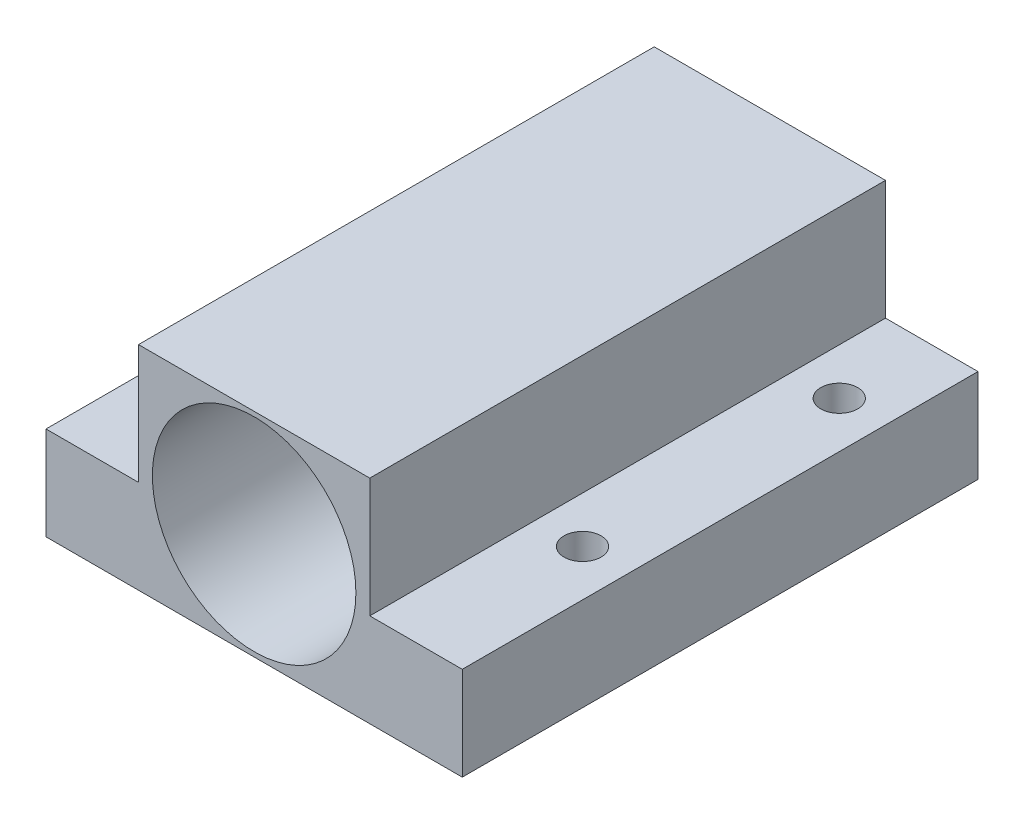
ISO-10303-21;
HEADER;
FILE_DESCRIPTION(('STEP AP214'),'2;1');
FILE_NAME('part.step','',(''),(''),'','','');
FILE_SCHEMA(('AUTOMOTIVE_DESIGN { 1 0 10303 214 1 1 1 1 }'));
ENDSEC;
DATA;
#1=APPLICATION_CONTEXT('core data for automotive mechanical design processes');
#2=APPLICATION_PROTOCOL_DEFINITION('international standard','automotive_design',2000,#1);
#3=PRODUCT_CONTEXT('',#1,'mechanical');
#4=PRODUCT('Part','Part','',(#3));
#5=PRODUCT_RELATED_PRODUCT_CATEGORY('part','',(#4));
#6=PRODUCT_DEFINITION_FORMATION('','',#4);
#7=PRODUCT_DEFINITION_CONTEXT('part definition',#1,'design');
#8=PRODUCT_DEFINITION('design','',#6,#7);
#9=PRODUCT_DEFINITION_SHAPE('','',#8);
#10=(LENGTH_UNIT() NAMED_UNIT(*) SI_UNIT(.MILLI.,.METRE.));
#11=(NAMED_UNIT(*) PLANE_ANGLE_UNIT() SI_UNIT($,.RADIAN.));
#12=(NAMED_UNIT(*) SI_UNIT($,.STERADIAN.) SOLID_ANGLE_UNIT());
#13=UNCERTAINTY_MEASURE_WITH_UNIT(LENGTH_MEASURE(1.E-05),#10,'distance_accuracy_value','');
#14=(GEOMETRIC_REPRESENTATION_CONTEXT(3) GLOBAL_UNCERTAINTY_ASSIGNED_CONTEXT((#13)) GLOBAL_UNIT_ASSIGNED_CONTEXT((#10,
#11,#12)) REPRESENTATION_CONTEXT('',''));
#15=CARTESIAN_POINT('',(0.,0.,0.));
#16=DIRECTION('',(0.,0.,1.));
#17=DIRECTION('',(1.,0.,0.));
#18=AXIS2_PLACEMENT_3D('',#15,#16,#17);
#19=CARTESIAN_POINT('',(0.,-5.2,106.287115073973));
#20=DIRECTION('',(0.,0.,-1.));
#21=DIRECTION('',(-1.,0.,0.));
#22=AXIS2_PLACEMENT_3D('',#19,#20,#21);
#23=CYLINDRICAL_SURFACE('',#22,11.);
#24=CARTESIAN_POINT('',(0.,-5.2,0.));
#25=DIRECTION('',(0.,0.,1.));
#26=DIRECTION('',(1.,0.,0.));
#27=AXIS2_PLACEMENT_3D('',#24,#25,#26);
#28=CIRCLE('',#27,11.);
#29=CARTESIAN_POINT('',(11.,-5.2,0.));
#30=VERTEX_POINT('',#29);
#31=EDGE_CURVE('E136',#30,#30,#28,.T.);
#32=ORIENTED_EDGE('',*,*,#31,.F.);
#33=EDGE_LOOP('',(#32));
#34=FACE_BOUND('',#33,.T.);
#35=CARTESIAN_POINT('',(0.,-5.2,55.7499999999998));
#36=DIRECTION('',(0.,0.,1.));
#37=DIRECTION('',(1.,0.,0.));
#38=AXIS2_PLACEMENT_3D('',#35,#36,#37);
#39=CIRCLE('',#38,11.);
#40=CARTESIAN_POINT('',(11.,-5.2,55.7499999999998));
#41=VERTEX_POINT('',#40);
#42=EDGE_CURVE('E105',#41,#41,#39,.T.);
#43=ORIENTED_EDGE('',*,*,#42,.T.);
#44=EDGE_LOOP('',(#43));
#45=FACE_BOUND('',#44,.T.);
#46=ADVANCED_FACE('F36',(#34,#45),#23,.F.);
#47=CARTESIAN_POINT('',(0.,0.,0.));
#48=DIRECTION('',(0.,0.,1.));
#49=DIRECTION('',(1.,0.,0.));
#50=AXIS2_PLACEMENT_3D('',#47,#48,#49);
#51=PLANE('',#50);
#52=ORIENTED_EDGE('',*,*,#31,.T.);
#53=EDGE_LOOP('',(#52));
#54=FACE_BOUND('',#53,.T.);
#55=DIRECTION('',(0.,-1.,0.));
#56=VECTOR('',#55,1.);
#57=CARTESIAN_POINT('',(12.5,0.,0.));
#58=LINE('',#57,#56);
#59=CARTESIAN_POINT('',(12.5,6.3,0.));
#60=VERTEX_POINT('',#59);
#61=CARTESIAN_POINT('',(12.5,-6.59999999999996,0.));
#62=VERTEX_POINT('',#61);
#63=EDGE_CURVE('E134',#60,#62,#58,.T.);
#64=ORIENTED_EDGE('',*,*,#63,.T.);
#65=DIRECTION('',(1.,0.,0.));
#66=VECTOR('',#65,1.);
#67=CARTESIAN_POINT('',(0.,-6.59999999999996,0.));
#68=LINE('',#67,#66);
#69=CARTESIAN_POINT('',(22.5,-6.59999999999996,0.));
#70=VERTEX_POINT('',#69);
#71=EDGE_CURVE('E111',#62,#70,#68,.T.);
#72=ORIENTED_EDGE('',*,*,#71,.T.);
#73=DIRECTION('',(0.,1.,0.));
#74=VECTOR('',#73,1.);
#75=CARTESIAN_POINT('',(22.5,0.,0.));
#76=LINE('',#75,#74);
#77=CARTESIAN_POINT('',(22.5,-16.7,0.));
#78=VERTEX_POINT('',#77);
#79=EDGE_CURVE('E116',#78,#70,#76,.T.);
#80=ORIENTED_EDGE('',*,*,#79,.F.);
#81=DIRECTION('',(1.,0.,0.));
#82=VECTOR('',#81,1.);
#83=CARTESIAN_POINT('',(0.,-16.7,0.));
#84=LINE('',#83,#82);
#85=CARTESIAN_POINT('',(-22.5,-16.7,0.));
#86=VERTEX_POINT('',#85);
#87=EDGE_CURVE('E153',#86,#78,#84,.T.);
#88=ORIENTED_EDGE('',*,*,#87,.F.);
#89=DIRECTION('',(0.,1.,0.));
#90=VECTOR('',#89,1.);
#91=CARTESIAN_POINT('',(-22.5,0.,0.));
#92=LINE('',#91,#90);
#93=CARTESIAN_POINT('',(-22.5,-6.59999999999996,0.));
#94=VERTEX_POINT('',#93);
#95=EDGE_CURVE('E150',#86,#94,#92,.T.);
#96=ORIENTED_EDGE('',*,*,#95,.T.);
#97=DIRECTION('',(-1.,0.,0.));
#98=VECTOR('',#97,1.);
#99=CARTESIAN_POINT('',(0.,-6.59999999999996,0.));
#100=LINE('',#99,#98);
#101=CARTESIAN_POINT('',(-12.5,-6.59999999999996,0.));
#102=VERTEX_POINT('',#101);
#103=EDGE_CURVE('E144',#102,#94,#100,.T.);
#104=ORIENTED_EDGE('',*,*,#103,.F.);
#105=DIRECTION('',(0.,-1.,0.));
#106=VECTOR('',#105,1.);
#107=CARTESIAN_POINT('',(-12.5,0.,0.));
#108=LINE('',#107,#106);
#109=CARTESIAN_POINT('',(-12.5,6.3,0.));
#110=VERTEX_POINT('',#109);
#111=EDGE_CURVE('E142',#110,#102,#108,.T.);
#112=ORIENTED_EDGE('',*,*,#111,.F.);
#113=DIRECTION('',(1.,0.,0.));
#114=VECTOR('',#113,1.);
#115=CARTESIAN_POINT('',(0.,6.3,0.));
#116=LINE('',#115,#114);
#117=EDGE_CURVE('E133',#110,#60,#116,.T.);
#118=ORIENTED_EDGE('',*,*,#117,.T.);
#119=EDGE_LOOP('',(#64,#72,#80,#88,#96,#104,#112,#118));
#120=FACE_BOUND('',#119,.T.);
#121=ADVANCED_FACE('F139',(#54,#120),#51,.F.);
#122=CARTESIAN_POINT('',(0.,-6.59999999999996,106.287115073973));
#123=DIRECTION('',(0.,1.,0.));
#124=DIRECTION('',(0.,0.,1.));
#125=AXIS2_PLACEMENT_3D('',#122,#123,#124);
#126=PLANE('',#125);
#127=CARTESIAN_POINT('',(17.4999999999999,-6.59999999999996,9.99999999999998));
#128=DIRECTION('',(0.,1.,0.));
#129=DIRECTION('',(-1.,0.,0.));
#130=AXIS2_PLACEMENT_3D('',#127,#128,#129);
#131=CIRCLE('',#130,2.);
#132=CARTESIAN_POINT('',(15.4999999999999,-6.59999999999996,9.99999999999998));
#133=VERTEX_POINT('',#132);
#134=EDGE_CURVE('E305',#133,#133,#131,.T.);
#135=ORIENTED_EDGE('',*,*,#134,.F.);
#136=EDGE_LOOP('',(#135));
#137=FACE_BOUND('',#136,.T.);
#138=CARTESIAN_POINT('',(17.4999999999999,-6.59999999999996,37.75));
#139=DIRECTION('',(0.,1.,0.));
#140=DIRECTION('',(-1.,0.,0.));
#141=AXIS2_PLACEMENT_3D('',#138,#139,#140);
#142=CIRCLE('',#141,2.);
#143=CARTESIAN_POINT('',(15.4999999999999,-6.59999999999996,37.75));
#144=VERTEX_POINT('',#143);
#145=EDGE_CURVE('E311',#144,#144,#142,.T.);
#146=ORIENTED_EDGE('',*,*,#145,.F.);
#147=EDGE_LOOP('',(#146));
#148=FACE_BOUND('',#147,.T.);
#149=DIRECTION('',(0.,0.,-1.));
#150=VECTOR('',#149,1.);
#151=CARTESIAN_POINT('',(12.5,-6.59999999999996,106.287115073973));
#152=LINE('',#151,#150);
#153=CARTESIAN_POINT('',(12.5,-6.59999999999996,55.7499999999998));
#154=VERTEX_POINT('',#153);
#155=EDGE_CURVE('E58',#154,#62,#152,.T.);
#156=ORIENTED_EDGE('',*,*,#155,.F.);
#157=DIRECTION('',(1.,0.,0.));
#158=VECTOR('',#157,1.);
#159=CARTESIAN_POINT('',(0.,-6.59999999999996,55.7499999999998));
#160=LINE('',#159,#158);
#161=CARTESIAN_POINT('',(22.5,-6.59999999999996,55.7499999999998));
#162=VERTEX_POINT('',#161);
#163=EDGE_CURVE('E11',#154,#162,#160,.T.);
#164=ORIENTED_EDGE('',*,*,#163,.T.);
#165=DIRECTION('',(0.,0.,-1.));
#166=VECTOR('',#165,1.);
#167=CARTESIAN_POINT('',(22.5,-6.59999999999996,106.287115073973));
#168=LINE('',#167,#166);
#169=EDGE_CURVE('E112',#162,#70,#168,.T.);
#170=ORIENTED_EDGE('',*,*,#169,.T.);
#171=ORIENTED_EDGE('',*,*,#71,.F.);
#172=EDGE_LOOP('',(#156,#164,#170,#171));
#173=FACE_BOUND('',#172,.T.);
#174=ADVANCED_FACE('F109',(#137,#148,#173),#126,.T.);
#175=CARTESIAN_POINT('',(22.5,0.,106.287115073973));
#176=DIRECTION('',(-1.,0.,0.));
#177=DIRECTION('',(0.,-1.,0.));
#178=AXIS2_PLACEMENT_3D('',#175,#176,#177);
#179=PLANE('',#178);
#180=DIRECTION('',(0.,1.,0.));
#181=VECTOR('',#180,1.);
#182=CARTESIAN_POINT('',(22.5,0.,55.7499999999998));
#183=LINE('',#182,#181);
#184=CARTESIAN_POINT('',(22.5,-16.7,55.7499999999998));
#185=VERTEX_POINT('',#184);
#186=EDGE_CURVE('E50',#185,#162,#183,.T.);
#187=ORIENTED_EDGE('',*,*,#186,.F.);
#188=DIRECTION('',(0.,0.,-1.));
#189=VECTOR('',#188,1.);
#190=CARTESIAN_POINT('',(22.5,-16.7,106.287115073973));
#191=LINE('',#190,#189);
#192=EDGE_CURVE('E114',#185,#78,#191,.T.);
#193=ORIENTED_EDGE('',*,*,#192,.T.);
#194=ORIENTED_EDGE('',*,*,#79,.T.);
#195=ORIENTED_EDGE('',*,*,#169,.F.);
#196=EDGE_LOOP('',(#187,#193,#194,#195));
#197=FACE_BOUND('',#196,.T.);
#198=ADVANCED_FACE('F158',(#197),#179,.F.);
#199=CARTESIAN_POINT('',(0.,-16.7,106.287115073973));
#200=DIRECTION('',(0.,1.,0.));
#201=DIRECTION('',(0.,0.,1.));
#202=AXIS2_PLACEMENT_3D('',#199,#200,#201);
#203=PLANE('',#202);
#204=CARTESIAN_POINT('',(-17.5000000000001,-16.7,37.75));
#205=DIRECTION('',(0.,1.,0.));
#206=DIRECTION('',(-1.,0.,0.));
#207=AXIS2_PLACEMENT_3D('',#204,#205,#206);
#208=CIRCLE('',#207,2.);
#209=CARTESIAN_POINT('',(-19.5000000000001,-16.7,37.75));
#210=VERTEX_POINT('',#209);
#211=EDGE_CURVE('E306',#210,#210,#208,.T.);
#212=ORIENTED_EDGE('',*,*,#211,.T.);
#213=EDGE_LOOP('',(#212));
#214=FACE_BOUND('',#213,.T.);
#215=CARTESIAN_POINT('',(17.4999999999999,-16.7,9.99999999999998));
#216=DIRECTION('',(0.,1.,0.));
#217=DIRECTION('',(-1.,0.,0.));
#218=AXIS2_PLACEMENT_3D('',#215,#216,#217);
#219=CIRCLE('',#218,2.);
#220=CARTESIAN_POINT('',(15.4999999999999,-16.7,9.99999999999998));
#221=VERTEX_POINT('',#220);
#222=EDGE_CURVE('E302',#221,#221,#219,.T.);
#223=ORIENTED_EDGE('',*,*,#222,.T.);
#224=EDGE_LOOP('',(#223));
#225=FACE_BOUND('',#224,.T.);
#226=CARTESIAN_POINT('',(17.4999999999999,-16.7,37.75));
#227=DIRECTION('',(0.,1.,0.));
#228=DIRECTION('',(-1.,0.,0.));
#229=AXIS2_PLACEMENT_3D('',#226,#227,#228);
#230=CIRCLE('',#229,2.);
#231=CARTESIAN_POINT('',(15.4999999999999,-16.7,37.75));
#232=VERTEX_POINT('',#231);
#233=EDGE_CURVE('E328',#232,#232,#230,.T.);
#234=ORIENTED_EDGE('',*,*,#233,.T.);
#235=EDGE_LOOP('',(#234));
#236=FACE_BOUND('',#235,.T.);
#237=CARTESIAN_POINT('',(-17.5,-16.7,10.));
#238=DIRECTION('',(0.,1.,0.));
#239=DIRECTION('',(-1.,0.,0.));
#240=AXIS2_PLACEMENT_3D('',#237,#238,#239);
#241=CIRCLE('',#240,2.);
#242=CARTESIAN_POINT('',(-19.5,-16.7,10.));
#243=VERTEX_POINT('',#242);
#244=EDGE_CURVE('E315',#243,#243,#241,.T.);
#245=ORIENTED_EDGE('',*,*,#244,.T.);
#246=EDGE_LOOP('',(#245));
#247=FACE_BOUND('',#246,.T.);
#248=DIRECTION('',(1.,0.,0.));
#249=VECTOR('',#248,1.);
#250=CARTESIAN_POINT('',(0.,-16.7,55.7499999999998));
#251=LINE('',#250,#249);
#252=CARTESIAN_POINT('',(-22.5,-16.7,55.7499999999998));
#253=VERTEX_POINT('',#252);
#254=EDGE_CURVE('E166',#253,#185,#251,.T.);
#255=ORIENTED_EDGE('',*,*,#254,.F.);
#256=DIRECTION('',(0.,0.,-1.));
#257=VECTOR('',#256,1.);
#258=CARTESIAN_POINT('',(-22.5,-16.7,106.287115073973));
#259=LINE('',#258,#257);
#260=EDGE_CURVE('E121',#253,#86,#259,.T.);
#261=ORIENTED_EDGE('',*,*,#260,.T.);
#262=ORIENTED_EDGE('',*,*,#87,.T.);
#263=ORIENTED_EDGE('',*,*,#192,.F.);
#264=EDGE_LOOP('',(#255,#261,#262,#263));
#265=FACE_BOUND('',#264,.T.);
#266=ADVANCED_FACE('F164',(#214,#225,#236,#247,#265),#203,.F.);
#267=CARTESIAN_POINT('',(-22.5,0.,106.287115073973));
#268=DIRECTION('',(-1.,0.,0.));
#269=DIRECTION('',(0.,-1.,0.));
#270=AXIS2_PLACEMENT_3D('',#267,#268,#269);
#271=PLANE('',#270);
#272=ORIENTED_EDGE('',*,*,#260,.F.);
#273=DIRECTION('',(0.,1.,0.));
#274=VECTOR('',#273,1.);
#275=CARTESIAN_POINT('',(-22.5,0.,55.7499999999998));
#276=LINE('',#275,#274);
#277=CARTESIAN_POINT('',(-22.5,-6.59999999999996,55.7499999999998));
#278=VERTEX_POINT('',#277);
#279=EDGE_CURVE('E170',#253,#278,#276,.T.);
#280=ORIENTED_EDGE('',*,*,#279,.T.);
#281=DIRECTION('',(0.,0.,-1.));
#282=VECTOR('',#281,1.);
#283=CARTESIAN_POINT('',(-22.5,-6.59999999999996,106.287115073973));
#284=LINE('',#283,#282);
#285=EDGE_CURVE('E123',#278,#94,#284,.T.);
#286=ORIENTED_EDGE('',*,*,#285,.T.);
#287=ORIENTED_EDGE('',*,*,#95,.F.);
#288=EDGE_LOOP('',(#272,#280,#286,#287));
#289=FACE_BOUND('',#288,.T.);
#290=ADVANCED_FACE('F169',(#289),#271,.T.);
#291=CARTESIAN_POINT('',(0.,-6.59999999999996,106.287115073973));
#292=DIRECTION('',(0.,-1.,0.));
#293=DIRECTION('',(1.,0.,0.));
#294=AXIS2_PLACEMENT_3D('',#291,#292,#293);
#295=PLANE('',#294);
#296=CARTESIAN_POINT('',(-17.5000000000001,-6.59999999999996,37.75));
#297=DIRECTION('',(0.,1.,0.));
#298=DIRECTION('',(-1.,0.,0.));
#299=AXIS2_PLACEMENT_3D('',#296,#297,#298);
#300=CIRCLE('',#299,2.);
#301=CARTESIAN_POINT('',(-19.5000000000001,-6.59999999999996,37.75));
#302=VERTEX_POINT('',#301);
#303=EDGE_CURVE('E309',#302,#302,#300,.T.);
#304=ORIENTED_EDGE('',*,*,#303,.F.);
#305=EDGE_LOOP('',(#304));
#306=FACE_BOUND('',#305,.T.);
#307=CARTESIAN_POINT('',(-17.5,-6.59999999999996,10.));
#308=DIRECTION('',(0.,1.,0.));
#309=DIRECTION('',(-1.,0.,0.));
#310=AXIS2_PLACEMENT_3D('',#307,#308,#309);
#311=CIRCLE('',#310,2.);
#312=CARTESIAN_POINT('',(-19.5,-6.59999999999996,10.));
#313=VERTEX_POINT('',#312);
#314=EDGE_CURVE('E318',#313,#313,#311,.T.);
#315=ORIENTED_EDGE('',*,*,#314,.F.);
#316=EDGE_LOOP('',(#315));
#317=FACE_BOUND('',#316,.T.);
#318=DIRECTION('',(-1.,0.,0.));
#319=VECTOR('',#318,1.);
#320=CARTESIAN_POINT('',(0.,-6.59999999999996,55.7499999999998));
#321=LINE('',#320,#319);
#322=CARTESIAN_POINT('',(-12.5,-6.59999999999996,55.7499999999998));
#323=VERTEX_POINT('',#322);
#324=EDGE_CURVE('E179',#323,#278,#321,.T.);
#325=ORIENTED_EDGE('',*,*,#324,.F.);
#326=DIRECTION('',(0.,0.,-1.));
#327=VECTOR('',#326,1.);
#328=CARTESIAN_POINT('',(-12.5,-6.59999999999996,106.287115073973));
#329=LINE('',#328,#327);
#330=EDGE_CURVE('E125',#323,#102,#329,.T.);
#331=ORIENTED_EDGE('',*,*,#330,.T.);
#332=ORIENTED_EDGE('',*,*,#103,.T.);
#333=ORIENTED_EDGE('',*,*,#285,.F.);
#334=EDGE_LOOP('',(#325,#331,#332,#333));
#335=FACE_BOUND('',#334,.T.);
#336=ADVANCED_FACE('F218',(#306,#317,#335),#295,.F.);
#337=CARTESIAN_POINT('',(-12.5,0.,106.287115073973));
#338=DIRECTION('',(1.,0.,0.));
#339=DIRECTION('',(0.,1.,0.));
#340=AXIS2_PLACEMENT_3D('',#337,#338,#339);
#341=PLANE('',#340);
#342=DIRECTION('',(0.,-1.,0.));
#343=VECTOR('',#342,1.);
#344=CARTESIAN_POINT('',(-12.5,0.,55.7499999999998));
#345=LINE('',#344,#343);
#346=CARTESIAN_POINT('',(-12.5,6.3,55.7499999999998));
#347=VERTEX_POINT('',#346);
#348=EDGE_CURVE('E178',#347,#323,#345,.T.);
#349=ORIENTED_EDGE('',*,*,#348,.F.);
#350=DIRECTION('',(0.,0.,-1.));
#351=VECTOR('',#350,1.);
#352=CARTESIAN_POINT('',(-12.5,6.3,106.287115073973));
#353=LINE('',#352,#351);
#354=EDGE_CURVE('E127',#347,#110,#353,.T.);
#355=ORIENTED_EDGE('',*,*,#354,.T.);
#356=ORIENTED_EDGE('',*,*,#111,.T.);
#357=ORIENTED_EDGE('',*,*,#330,.F.);
#358=EDGE_LOOP('',(#349,#355,#356,#357));
#359=FACE_BOUND('',#358,.T.);
#360=ADVANCED_FACE('F176',(#359),#341,.F.);
#361=CARTESIAN_POINT('',(0.,6.3,106.287115073973));
#362=DIRECTION('',(0.,1.,0.));
#363=DIRECTION('',(0.,0.,1.));
#364=AXIS2_PLACEMENT_3D('',#361,#362,#363);
#365=PLANE('',#364);
#366=ORIENTED_EDGE('',*,*,#354,.F.);
#367=DIRECTION('',(1.,0.,0.));
#368=VECTOR('',#367,1.);
#369=CARTESIAN_POINT('',(0.,6.3,55.7499999999998));
#370=LINE('',#369,#368);
#371=CARTESIAN_POINT('',(12.5,6.3,55.7499999999998));
#372=VERTEX_POINT('',#371);
#373=EDGE_CURVE('E106',#347,#372,#370,.T.);
#374=ORIENTED_EDGE('',*,*,#373,.T.);
#375=DIRECTION('',(0.,0.,-1.));
#376=VECTOR('',#375,1.);
#377=CARTESIAN_POINT('',(12.5,6.3,106.287115073973));
#378=LINE('',#377,#376);
#379=EDGE_CURVE('E43',#372,#60,#378,.T.);
#380=ORIENTED_EDGE('',*,*,#379,.T.);
#381=ORIENTED_EDGE('',*,*,#117,.F.);
#382=EDGE_LOOP('',(#366,#374,#380,#381));
#383=FACE_BOUND('',#382,.T.);
#384=ADVANCED_FACE('F131',(#383),#365,.T.);
#385=CARTESIAN_POINT('',(12.5,0.,106.287115073973));
#386=DIRECTION('',(1.,0.,0.));
#387=DIRECTION('',(0.,1.,0.));
#388=AXIS2_PLACEMENT_3D('',#385,#386,#387);
#389=PLANE('',#388);
#390=ORIENTED_EDGE('',*,*,#379,.F.);
#391=DIRECTION('',(0.,-1.,0.));
#392=VECTOR('',#391,1.);
#393=CARTESIAN_POINT('',(12.5,0.,55.7499999999998));
#394=LINE('',#393,#392);
#395=EDGE_CURVE('E100',#372,#154,#394,.T.);
#396=ORIENTED_EDGE('',*,*,#395,.T.);
#397=ORIENTED_EDGE('',*,*,#155,.T.);
#398=ORIENTED_EDGE('',*,*,#63,.F.);
#399=EDGE_LOOP('',(#390,#396,#397,#398));
#400=FACE_BOUND('',#399,.T.);
#401=ADVANCED_FACE('F103',(#400),#389,.T.);
#402=CARTESIAN_POINT('',(284.590151880348,-28.5,55.7499999999996));
#403=DIRECTION('',(0.,0.,1.));
#404=DIRECTION('',(-1.,0.,0.));
#405=AXIS2_PLACEMENT_3D('',#402,#403,#404);
#406=PLANE('',#405);
#407=ORIENTED_EDGE('',*,*,#42,.F.);
#408=EDGE_LOOP('',(#407));
#409=FACE_BOUND('',#408,.T.);
#410=ORIENTED_EDGE('',*,*,#395,.F.);
#411=ORIENTED_EDGE('',*,*,#373,.F.);
#412=ORIENTED_EDGE('',*,*,#348,.T.);
#413=ORIENTED_EDGE('',*,*,#324,.T.);
#414=ORIENTED_EDGE('',*,*,#279,.F.);
#415=ORIENTED_EDGE('',*,*,#254,.T.);
#416=ORIENTED_EDGE('',*,*,#186,.T.);
#417=ORIENTED_EDGE('',*,*,#163,.F.);
#418=EDGE_LOOP('',(#410,#411,#412,#413,#414,#415,#416,#417));
#419=FACE_BOUND('',#418,.T.);
#420=ADVANCED_FACE('F99',(#409,#419),#406,.T.);
#421=CARTESIAN_POINT('',(-17.5,-16.7,10.));
#422=DIRECTION('',(0.,1.,0.));
#423=DIRECTION('',(-1.,0.,0.));
#424=AXIS2_PLACEMENT_3D('',#421,#422,#423);
#425=CYLINDRICAL_SURFACE('',#424,2.);
#426=ORIENTED_EDGE('',*,*,#244,.F.);
#427=EDGE_LOOP('',(#426));
#428=FACE_BOUND('',#427,.T.);
#429=ORIENTED_EDGE('',*,*,#314,.T.);
#430=EDGE_LOOP('',(#429));
#431=FACE_BOUND('',#430,.T.);
#432=ADVANCED_FACE('F195',(#428,#431),#425,.F.);
#433=CARTESIAN_POINT('',(-17.5000000000001,-16.7,37.75));
#434=DIRECTION('',(0.,1.,0.));
#435=DIRECTION('',(-1.,0.,0.));
#436=AXIS2_PLACEMENT_3D('',#433,#434,#435);
#437=CYLINDRICAL_SURFACE('',#436,2.);
#438=ORIENTED_EDGE('',*,*,#211,.F.);
#439=EDGE_LOOP('',(#438));
#440=FACE_BOUND('',#439,.T.);
#441=ORIENTED_EDGE('',*,*,#303,.T.);
#442=EDGE_LOOP('',(#441));
#443=FACE_BOUND('',#442,.T.);
#444=ADVANCED_FACE('F201',(#440,#443),#437,.F.);
#445=CARTESIAN_POINT('',(17.4999999999999,-16.7,37.75));
#446=DIRECTION('',(0.,1.,0.));
#447=DIRECTION('',(-1.,0.,0.));
#448=AXIS2_PLACEMENT_3D('',#445,#446,#447);
#449=CYLINDRICAL_SURFACE('',#448,2.);
#450=ORIENTED_EDGE('',*,*,#233,.F.);
#451=EDGE_LOOP('',(#450));
#452=FACE_BOUND('',#451,.T.);
#453=ORIENTED_EDGE('',*,*,#145,.T.);
#454=EDGE_LOOP('',(#453));
#455=FACE_BOUND('',#454,.T.);
#456=ADVANCED_FACE('F276',(#452,#455),#449,.F.);
#457=CARTESIAN_POINT('',(17.4999999999999,-16.7,9.99999999999998));
#458=DIRECTION('',(0.,1.,0.));
#459=DIRECTION('',(-1.,0.,0.));
#460=AXIS2_PLACEMENT_3D('',#457,#458,#459);
#461=CYLINDRICAL_SURFACE('',#460,2.);
#462=ORIENTED_EDGE('',*,*,#222,.F.);
#463=EDGE_LOOP('',(#462));
#464=FACE_BOUND('',#463,.T.);
#465=ORIENTED_EDGE('',*,*,#134,.T.);
#466=EDGE_LOOP('',(#465));
#467=FACE_BOUND('',#466,.T.);
#468=ADVANCED_FACE('F286',(#464,#467),#461,.F.);
#469=CLOSED_SHELL('',(#46,#121,#174,#198,#266,#290,#336,#360,#384,#401,#420,#432,#444,#456,#468));
#470=MANIFOLD_SOLID_BREP('B2',#469);
#471=ADVANCED_BREP_SHAPE_REPRESENTATION('',(#18,#470),#14);
#472=SHAPE_DEFINITION_REPRESENTATION(#9,#471);
ENDSEC;
END-ISO-10303-21;
